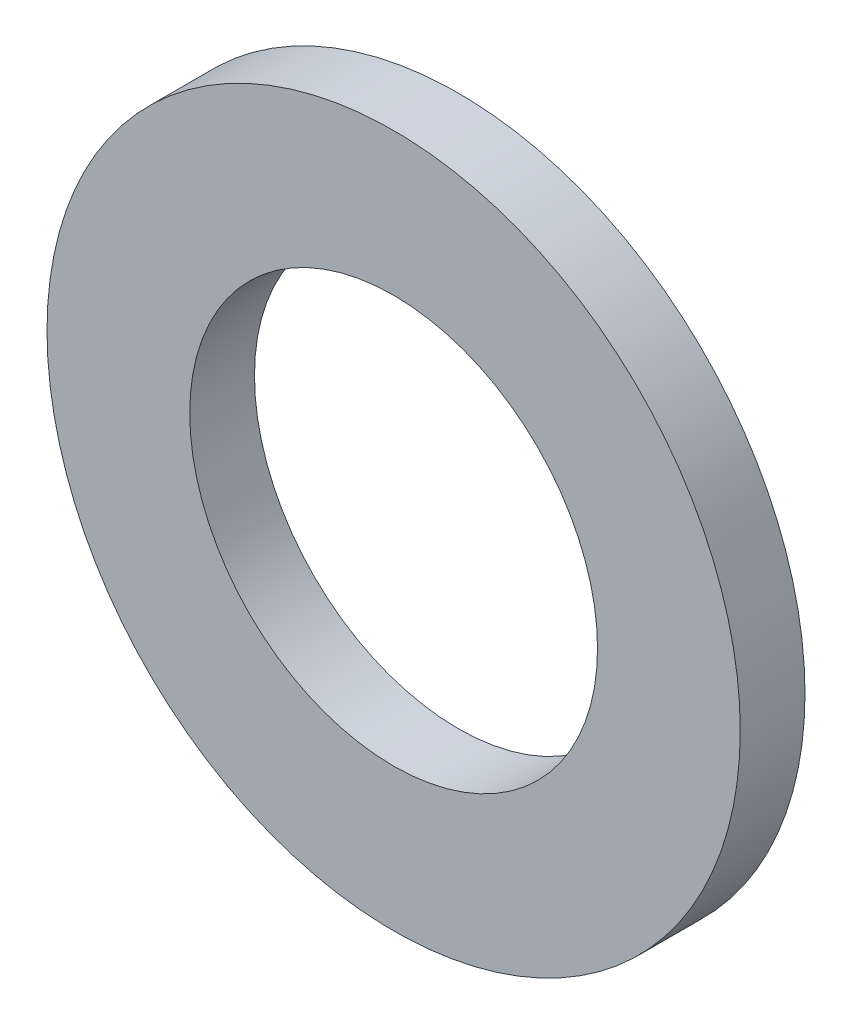
ISO-10303-21;
HEADER;
FILE_DESCRIPTION(('STEP AP214'),'2;1');
FILE_NAME('part.step','',(''),(''),'','','');
FILE_SCHEMA(('AUTOMOTIVE_DESIGN { 1 0 10303 214 1 1 1 1 }'));
ENDSEC;
DATA;
#1=APPLICATION_CONTEXT('core data for automotive mechanical design processes');
#2=APPLICATION_PROTOCOL_DEFINITION('international standard','automotive_design',2000,#1);
#3=PRODUCT_CONTEXT('',#1,'mechanical');
#4=PRODUCT('Part','Part','',(#3));
#5=PRODUCT_RELATED_PRODUCT_CATEGORY('part','',(#4));
#6=PRODUCT_DEFINITION_FORMATION('','',#4);
#7=PRODUCT_DEFINITION_CONTEXT('part definition',#1,'design');
#8=PRODUCT_DEFINITION('design','',#6,#7);
#9=PRODUCT_DEFINITION_SHAPE('','',#8);
#10=(LENGTH_UNIT() NAMED_UNIT(*) SI_UNIT(.MILLI.,.METRE.));
#11=(NAMED_UNIT(*) PLANE_ANGLE_UNIT() SI_UNIT($,.RADIAN.));
#12=(NAMED_UNIT(*) SI_UNIT($,.STERADIAN.) SOLID_ANGLE_UNIT());
#13=UNCERTAINTY_MEASURE_WITH_UNIT(LENGTH_MEASURE(1.E-05),#10,'distance_accuracy_value','');
#14=(GEOMETRIC_REPRESENTATION_CONTEXT(3) GLOBAL_UNCERTAINTY_ASSIGNED_CONTEXT((#13)) GLOBAL_UNIT_ASSIGNED_CONTEXT((#10,
#11,#12)) REPRESENTATION_CONTEXT('',''));
#15=CARTESIAN_POINT('',(0.,0.,0.));
#16=DIRECTION('',(0.,0.,1.));
#17=DIRECTION('',(1.,0.,0.));
#18=AXIS2_PLACEMENT_3D('',#15,#16,#17);
#19=CARTESIAN_POINT('',(0.,0.,1.5875));
#20=DIRECTION('',(0.,0.,1.));
#21=DIRECTION('',(1.,0.,0.));
#22=AXIS2_PLACEMENT_3D('',#19,#20,#21);
#23=PLANE('',#22);
#24=CARTESIAN_POINT('',(0.,0.,1.5875));
#25=DIRECTION('',(0.,0.,1.));
#26=DIRECTION('',(1.,0.,0.));
#27=AXIS2_PLACEMENT_3D('',#24,#25,#26);
#28=CIRCLE('',#27,8.5);
#29=CARTESIAN_POINT('',(8.5,0.,1.5875));
#30=VERTEX_POINT('',#29);
#31=EDGE_CURVE('E10',#30,#30,#28,.T.);
#32=ORIENTED_EDGE('',*,*,#31,.T.);
#33=EDGE_LOOP('',(#32));
#34=FACE_BOUND('',#33,.T.);
#35=CARTESIAN_POINT('',(0.,0.,1.5875));
#36=DIRECTION('',(0.,0.,1.));
#37=DIRECTION('',(1.,0.,0.));
#38=AXIS2_PLACEMENT_3D('',#35,#36,#37);
#39=CIRCLE('',#38,5.);
#40=CARTESIAN_POINT('',(5.,0.,1.5875));
#41=VERTEX_POINT('',#40);
#42=EDGE_CURVE('E41',#41,#41,#39,.T.);
#43=ORIENTED_EDGE('',*,*,#42,.F.);
#44=EDGE_LOOP('',(#43));
#45=FACE_BOUND('',#44,.T.);
#46=ADVANCED_FACE('F30',(#34,#45),#23,.T.);
#47=CARTESIAN_POINT('',(0.,0.,0.));
#48=DIRECTION('',(0.,0.,1.));
#49=DIRECTION('',(1.,0.,0.));
#50=AXIS2_PLACEMENT_3D('',#47,#48,#49);
#51=PLANE('',#50);
#52=CARTESIAN_POINT('',(0.,0.,0.));
#53=DIRECTION('',(0.,0.,1.));
#54=DIRECTION('',(1.,0.,0.));
#55=AXIS2_PLACEMENT_3D('',#52,#53,#54);
#56=CIRCLE('',#55,8.5);
#57=CARTESIAN_POINT('',(8.5,0.,0.));
#58=VERTEX_POINT('',#57);
#59=EDGE_CURVE('E34',#58,#58,#56,.T.);
#60=ORIENTED_EDGE('',*,*,#59,.F.);
#61=EDGE_LOOP('',(#60));
#62=FACE_BOUND('',#61,.T.);
#63=CARTESIAN_POINT('',(0.,0.,0.));
#64=DIRECTION('',(0.,0.,1.));
#65=DIRECTION('',(1.,0.,0.));
#66=AXIS2_PLACEMENT_3D('',#63,#64,#65);
#67=CIRCLE('',#66,5.);
#68=CARTESIAN_POINT('',(5.,0.,0.));
#69=VERTEX_POINT('',#68);
#70=EDGE_CURVE('E43',#69,#69,#67,.T.);
#71=ORIENTED_EDGE('',*,*,#70,.T.);
#72=EDGE_LOOP('',(#71));
#73=FACE_BOUND('',#72,.T.);
#74=ADVANCED_FACE('F53',(#62,#73),#51,.F.);
#75=CARTESIAN_POINT('',(0.,0.,1.5875));
#76=DIRECTION('',(0.,0.,-1.));
#77=DIRECTION('',(-1.,0.,0.));
#78=AXIS2_PLACEMENT_3D('',#75,#76,#77);
#79=CYLINDRICAL_SURFACE('',#78,8.5);
#80=ORIENTED_EDGE('',*,*,#31,.F.);
#81=EDGE_LOOP('',(#80));
#82=FACE_BOUND('',#81,.T.);
#83=ORIENTED_EDGE('',*,*,#59,.T.);
#84=EDGE_LOOP('',(#83));
#85=FACE_BOUND('',#84,.T.);
#86=ADVANCED_FACE('F32',(#82,#85),#79,.T.);
#87=CARTESIAN_POINT('',(0.,0.,1.5875));
#88=DIRECTION('',(0.,0.,-1.));
#89=DIRECTION('',(-1.,0.,0.));
#90=AXIS2_PLACEMENT_3D('',#87,#88,#89);
#91=CYLINDRICAL_SURFACE('',#90,5.);
#92=ORIENTED_EDGE('',*,*,#42,.T.);
#93=EDGE_LOOP('',(#92));
#94=FACE_BOUND('',#93,.T.);
#95=ORIENTED_EDGE('',*,*,#70,.F.);
#96=EDGE_LOOP('',(#95));
#97=FACE_BOUND('',#96,.T.);
#98=ADVANCED_FACE('F49',(#94,#97),#91,.F.);
#99=CLOSED_SHELL('',(#46,#74,#86,#98));
#100=MANIFOLD_SOLID_BREP('B2',#99);
#101=ADVANCED_BREP_SHAPE_REPRESENTATION('',(#18,#100),#14);
#102=SHAPE_DEFINITION_REPRESENTATION(#9,#101);
ENDSEC;
END-ISO-10303-21;
